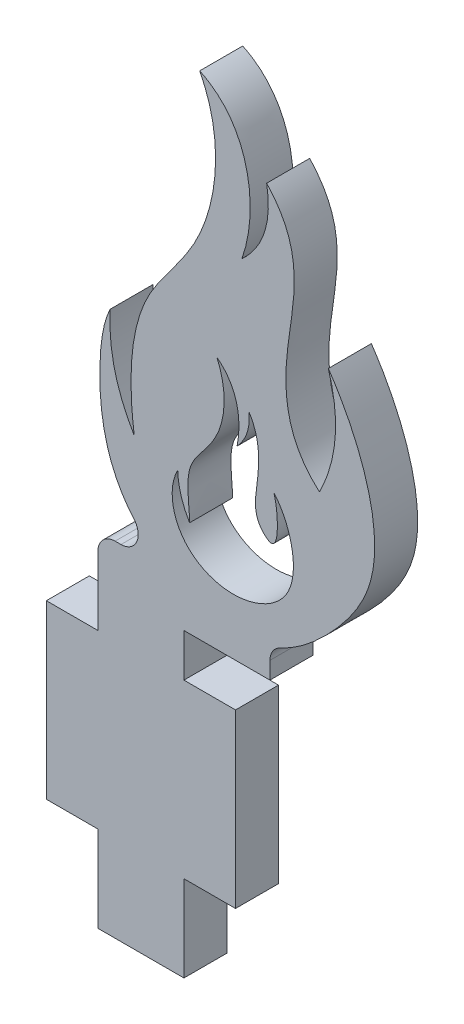
ISO-10303-21;
HEADER;
FILE_DESCRIPTION(('STEP AP214'),'2;1');
FILE_NAME('part.step','',(''),(''),'','','');
FILE_SCHEMA(('AUTOMOTIVE_DESIGN { 1 0 10303 214 1 1 1 1 }'));
ENDSEC;
DATA;
#1=APPLICATION_CONTEXT('core data for automotive mechanical design processes');
#2=APPLICATION_PROTOCOL_DEFINITION('international standard','automotive_design',2000,#1);
#3=PRODUCT_CONTEXT('',#1,'mechanical');
#4=PRODUCT('Part','Part','',(#3));
#5=PRODUCT_RELATED_PRODUCT_CATEGORY('part','',(#4));
#6=PRODUCT_DEFINITION_FORMATION('','',#4);
#7=PRODUCT_DEFINITION_CONTEXT('part definition',#1,'design');
#8=PRODUCT_DEFINITION('design','',#6,#7);
#9=PRODUCT_DEFINITION_SHAPE('','',#8);
#10=(LENGTH_UNIT() NAMED_UNIT(*) SI_UNIT(.MILLI.,.METRE.));
#11=(NAMED_UNIT(*) PLANE_ANGLE_UNIT() SI_UNIT($,.RADIAN.));
#12=(NAMED_UNIT(*) SI_UNIT($,.STERADIAN.) SOLID_ANGLE_UNIT());
#13=UNCERTAINTY_MEASURE_WITH_UNIT(LENGTH_MEASURE(1.E-05),#10,'distance_accuracy_value','');
#14=(GEOMETRIC_REPRESENTATION_CONTEXT(3) GLOBAL_UNCERTAINTY_ASSIGNED_CONTEXT((#13)) GLOBAL_UNIT_ASSIGNED_CONTEXT((#10,
#11,#12)) REPRESENTATION_CONTEXT('',''));
#15=CARTESIAN_POINT('',(0.,0.,0.));
#16=DIRECTION('',(0.,0.,1.));
#17=DIRECTION('',(1.,0.,0.));
#18=AXIS2_PLACEMENT_3D('',#15,#16,#17);
#19=CARTESIAN_POINT('',(0.,10.,2.5));
#20=DIRECTION('',(0.,1.,0.));
#21=DIRECTION('',(0.,0.,1.));
#22=AXIS2_PLACEMENT_3D('',#19,#20,#21);
#23=PLANE('',#22);
#24=DIRECTION('',(1.,0.,0.));
#25=VECTOR('',#24,1.);
#26=CARTESIAN_POINT('',(0.,10.,0.));
#27=LINE('',#26,#25);
#28=CARTESIAN_POINT('',(-1.5,10.,0.));
#29=VERTEX_POINT('',#28);
#30=CARTESIAN_POINT('',(-1.15846621936042,10.,0.));
#31=VERTEX_POINT('',#30);
#32=EDGE_CURVE('E456',#29,#31,#27,.T.);
#33=ORIENTED_EDGE('',*,*,#32,.F.);
#34=DIRECTION('',(0.,0.,-1.));
#35=VECTOR('',#34,1.);
#36=CARTESIAN_POINT('',(-1.5,10.,2.5));
#37=LINE('',#36,#35);
#38=CARTESIAN_POINT('',(-1.5,10.,2.5));
#39=VERTEX_POINT('',#38);
#40=EDGE_CURVE('E493',#29,#39,#37,.F.);
#41=ORIENTED_EDGE('',*,*,#40,.T.);
#42=DIRECTION('',(1.,0.,0.));
#43=VECTOR('',#42,1.);
#44=CARTESIAN_POINT('',(0.,10.,2.5));
#45=LINE('',#44,#43);
#46=CARTESIAN_POINT('',(-1.15846621936042,10.,2.5));
#47=VERTEX_POINT('',#46);
#48=EDGE_CURVE('E426',#39,#47,#45,.T.);
#49=ORIENTED_EDGE('',*,*,#48,.T.);
#50=DIRECTION('',(0.,0.,-1.));
#51=VECTOR('',#50,1.);
#52=CARTESIAN_POINT('',(-1.15846621936042,10.,2.5));
#53=LINE('',#52,#51);
#54=EDGE_CURVE('E490',#47,#31,#53,.T.);
#55=ORIENTED_EDGE('',*,*,#54,.T.);
#56=EDGE_LOOP('',(#33,#41,#49,#55));
#57=FACE_BOUND('',#56,.T.);
#58=ADVANCED_FACE('F36',(#57),#23,.T.);
#59=CARTESIAN_POINT('',(7.5,10.,-5.59016994374948));
#60=DIRECTION('',(1.,0.,0.));
#61=DIRECTION('',(0.,1.,0.));
#62=AXIS2_PLACEMENT_3D('',#59,#60,#61);
#63=PLANE('',#62);
#64=DIRECTION('',(0.,-1.,0.));
#65=VECTOR('',#64,1.);
#66=CARTESIAN_POINT('',(7.5,10.,0.));
#67=LINE('',#66,#65);
#68=CARTESIAN_POINT('',(7.5,8.49663509652156,0.));
#69=VERTEX_POINT('',#68);
#70=CARTESIAN_POINT('',(7.5,7.5,0.));
#71=VERTEX_POINT('',#70);
#72=EDGE_CURVE('E387',#69,#71,#67,.T.);
#73=ORIENTED_EDGE('',*,*,#72,.F.);
#74=DIRECTION('',(0.,0.,-1.));
#75=VECTOR('',#74,1.);
#76=CARTESIAN_POINT('',(7.5,8.49663509652156,-5.59016994374948));
#77=LINE('',#76,#75);
#78=CARTESIAN_POINT('',(7.5,8.49663509652156,2.5));
#79=VERTEX_POINT('',#78);
#80=EDGE_CURVE('E498',#69,#79,#77,.F.);
#81=ORIENTED_EDGE('',*,*,#80,.T.);
#82=DIRECTION('',(0.,1.,0.));
#83=VECTOR('',#82,1.);
#84=CARTESIAN_POINT('',(7.5,10.,2.5));
#85=LINE('',#84,#83);
#86=CARTESIAN_POINT('',(7.5,7.5,2.5));
#87=VERTEX_POINT('',#86);
#88=EDGE_CURVE('E393',#87,#79,#85,.T.);
#89=ORIENTED_EDGE('',*,*,#88,.F.);
#90=DIRECTION('',(0.,0.,1.));
#91=VECTOR('',#90,1.);
#92=CARTESIAN_POINT('',(7.5,7.5,-5.59016994374948));
#93=LINE('',#92,#91);
#94=EDGE_CURVE('E390',#71,#87,#93,.T.);
#95=ORIENTED_EDGE('',*,*,#94,.F.);
#96=EDGE_LOOP('',(#73,#81,#89,#95));
#97=FACE_BOUND('',#96,.T.);
#98=ADVANCED_FACE('F565',(#97),#63,.T.);
#99=CARTESIAN_POINT('',(-5.5,0.,2.5));
#100=DIRECTION('',(1.,0.,0.));
#101=DIRECTION('',(0.,1.,0.));
#102=AXIS2_PLACEMENT_3D('',#99,#100,#101);
#103=PLANE('',#102);
#104=DIRECTION('',(0.,-1.,0.));
#105=VECTOR('',#104,1.);
#106=CARTESIAN_POINT('',(-5.5,0.,0.));
#107=LINE('',#106,#105);
#108=CARTESIAN_POINT('',(-5.50000000000001,5.,0.));
#109=VERTEX_POINT('',#108);
#110=CARTESIAN_POINT('',(-5.5,-5.,0.));
#111=VERTEX_POINT('',#110);
#112=EDGE_CURVE('E401',#109,#111,#107,.T.);
#113=ORIENTED_EDGE('',*,*,#112,.T.);
#114=DIRECTION('',(0.,0.,-1.));
#115=VECTOR('',#114,1.);
#116=CARTESIAN_POINT('',(-5.5,-5.,2.5));
#117=LINE('',#116,#115);
#118=CARTESIAN_POINT('',(-5.5,-5.,2.5));
#119=VERTEX_POINT('',#118);
#120=EDGE_CURVE('E482',#119,#111,#117,.T.);
#121=ORIENTED_EDGE('',*,*,#120,.F.);
#122=DIRECTION('',(0.,-1.,0.));
#123=VECTOR('',#122,1.);
#124=CARTESIAN_POINT('',(-5.5,0.,2.5));
#125=LINE('',#124,#123);
#126=CARTESIAN_POINT('',(-5.50000000000001,5.,2.5));
#127=VERTEX_POINT('',#126);
#128=EDGE_CURVE('E402',#127,#119,#125,.T.);
#129=ORIENTED_EDGE('',*,*,#128,.F.);
#130=DIRECTION('',(0.,0.,-1.));
#131=VECTOR('',#130,1.);
#132=CARTESIAN_POINT('',(-5.50000000000001,5.,2.5));
#133=LINE('',#132,#131);
#134=EDGE_CURVE('E432',#127,#109,#133,.T.);
#135=ORIENTED_EDGE('',*,*,#134,.T.);
#136=EDGE_LOOP('',(#113,#121,#129,#135));
#137=FACE_BOUND('',#136,.T.);
#138=ADVANCED_FACE('F608',(#137),#103,.F.);
#139=CARTESIAN_POINT('',(0.,-5.,2.5));
#140=DIRECTION('',(0.,1.,0.));
#141=DIRECTION('',(-1.,0.,0.));
#142=AXIS2_PLACEMENT_3D('',#139,#140,#141);
#143=PLANE('',#142);
#144=DIRECTION('',(1.,0.,0.));
#145=VECTOR('',#144,1.);
#146=CARTESIAN_POINT('',(0.,-5.,0.));
#147=LINE('',#146,#145);
#148=CARTESIAN_POINT('',(-2.5,-5.,0.));
#149=VERTEX_POINT('',#148);
#150=EDGE_CURVE('E435',#111,#149,#147,.T.);
#151=ORIENTED_EDGE('',*,*,#150,.T.);
#152=DIRECTION('',(0.,0.,-1.));
#153=VECTOR('',#152,1.);
#154=CARTESIAN_POINT('',(-2.5,-5.,2.5));
#155=LINE('',#154,#153);
#156=CARTESIAN_POINT('',(-2.5,-5.,2.5));
#157=VERTEX_POINT('',#156);
#158=EDGE_CURVE('E479',#157,#149,#155,.T.);
#159=ORIENTED_EDGE('',*,*,#158,.F.);
#160=DIRECTION('',(1.,0.,0.));
#161=VECTOR('',#160,1.);
#162=CARTESIAN_POINT('',(0.,-5.,2.5));
#163=LINE('',#162,#161);
#164=EDGE_CURVE('E405',#119,#157,#163,.T.);
#165=ORIENTED_EDGE('',*,*,#164,.F.);
#166=ORIENTED_EDGE('',*,*,#120,.T.);
#167=EDGE_LOOP('',(#151,#159,#165,#166));
#168=FACE_BOUND('',#167,.T.);
#169=ADVANCED_FACE('F605',(#168),#143,.F.);
#170=CARTESIAN_POINT('',(-2.5,0.,2.5));
#171=DIRECTION('',(1.,0.,0.));
#172=DIRECTION('',(0.,1.,0.));
#173=AXIS2_PLACEMENT_3D('',#170,#171,#172);
#174=PLANE('',#173);
#175=DIRECTION('',(0.,-1.,0.));
#176=VECTOR('',#175,1.);
#177=CARTESIAN_POINT('',(-2.5,0.,0.));
#178=LINE('',#177,#176);
#179=CARTESIAN_POINT('',(-2.5,-10.,0.));
#180=VERTEX_POINT('',#179);
#181=EDGE_CURVE('E437',#149,#180,#178,.T.);
#182=ORIENTED_EDGE('',*,*,#181,.T.);
#183=DIRECTION('',(0.,0.,-1.));
#184=VECTOR('',#183,1.);
#185=CARTESIAN_POINT('',(-2.5,-10.,2.5));
#186=LINE('',#185,#184);
#187=CARTESIAN_POINT('',(-2.5,-10.,2.5));
#188=VERTEX_POINT('',#187);
#189=EDGE_CURVE('E476',#188,#180,#186,.T.);
#190=ORIENTED_EDGE('',*,*,#189,.F.);
#191=DIRECTION('',(0.,-1.,0.));
#192=VECTOR('',#191,1.);
#193=CARTESIAN_POINT('',(-2.5,0.,2.5));
#194=LINE('',#193,#192);
#195=EDGE_CURVE('E408',#157,#188,#194,.T.);
#196=ORIENTED_EDGE('',*,*,#195,.F.);
#197=ORIENTED_EDGE('',*,*,#158,.T.);
#198=EDGE_LOOP('',(#182,#190,#196,#197));
#199=FACE_BOUND('',#198,.T.);
#200=ADVANCED_FACE('F599',(#199),#174,.F.);
#201=CARTESIAN_POINT('',(0.,-10.,2.5));
#202=DIRECTION('',(0.,1.,0.));
#203=DIRECTION('',(0.,0.,1.));
#204=AXIS2_PLACEMENT_3D('',#201,#202,#203);
#205=PLANE('',#204);
#206=DIRECTION('',(1.,0.,0.));
#207=VECTOR('',#206,1.);
#208=CARTESIAN_POINT('',(0.,-10.,0.));
#209=LINE('',#208,#207);
#210=CARTESIAN_POINT('',(2.5,-10.,0.));
#211=VERTEX_POINT('',#210);
#212=EDGE_CURVE('E439',#180,#211,#209,.T.);
#213=ORIENTED_EDGE('',*,*,#212,.T.);
#214=DIRECTION('',(0.,0.,-1.));
#215=VECTOR('',#214,1.);
#216=CARTESIAN_POINT('',(2.5,-10.,2.5));
#217=LINE('',#216,#215);
#218=CARTESIAN_POINT('',(2.5,-10.,2.5));
#219=VERTEX_POINT('',#218);
#220=EDGE_CURVE('E474',#219,#211,#217,.T.);
#221=ORIENTED_EDGE('',*,*,#220,.F.);
#222=DIRECTION('',(1.,0.,0.));
#223=VECTOR('',#222,1.);
#224=CARTESIAN_POINT('',(0.,-10.,2.5));
#225=LINE('',#224,#223);
#226=EDGE_CURVE('E410',#188,#219,#225,.T.);
#227=ORIENTED_EDGE('',*,*,#226,.F.);
#228=ORIENTED_EDGE('',*,*,#189,.T.);
#229=EDGE_LOOP('',(#213,#221,#227,#228));
#230=FACE_BOUND('',#229,.T.);
#231=ADVANCED_FACE('F595',(#230),#205,.F.);
#232=CARTESIAN_POINT('',(2.5,0.,2.5));
#233=DIRECTION('',(1.,0.,0.));
#234=DIRECTION('',(0.,1.,0.));
#235=AXIS2_PLACEMENT_3D('',#232,#233,#234);
#236=PLANE('',#235);
#237=DIRECTION('',(0.,-1.,0.));
#238=VECTOR('',#237,1.);
#239=CARTESIAN_POINT('',(2.5,0.,0.));
#240=LINE('',#239,#238);
#241=CARTESIAN_POINT('',(2.5,-5.,0.));
#242=VERTEX_POINT('',#241);
#243=EDGE_CURVE('E443',#242,#211,#240,.T.);
#244=ORIENTED_EDGE('',*,*,#243,.F.);
#245=DIRECTION('',(0.,0.,-1.));
#246=VECTOR('',#245,1.);
#247=CARTESIAN_POINT('',(2.5,-5.,2.5));
#248=LINE('',#247,#246);
#249=CARTESIAN_POINT('',(2.5,-5.,2.5));
#250=VERTEX_POINT('',#249);
#251=EDGE_CURVE('E472',#250,#242,#248,.T.);
#252=ORIENTED_EDGE('',*,*,#251,.F.);
#253=DIRECTION('',(0.,-1.,0.));
#254=VECTOR('',#253,1.);
#255=CARTESIAN_POINT('',(2.5,0.,2.5));
#256=LINE('',#255,#254);
#257=EDGE_CURVE('E413',#250,#219,#256,.T.);
#258=ORIENTED_EDGE('',*,*,#257,.T.);
#259=ORIENTED_EDGE('',*,*,#220,.T.);
#260=EDGE_LOOP('',(#244,#252,#258,#259));
#261=FACE_BOUND('',#260,.T.);
#262=ADVANCED_FACE('F590',(#261),#236,.T.);
#263=CARTESIAN_POINT('',(0.,-5.,2.5));
#264=DIRECTION('',(0.,-1.,0.));
#265=DIRECTION('',(1.,0.,0.));
#266=AXIS2_PLACEMENT_3D('',#263,#264,#265);
#267=PLANE('',#266);
#268=DIRECTION('',(-1.,0.,0.));
#269=VECTOR('',#268,1.);
#270=CARTESIAN_POINT('',(0.,-5.,0.));
#271=LINE('',#270,#269);
#272=CARTESIAN_POINT('',(5.5,-5.,0.));
#273=VERTEX_POINT('',#272);
#274=EDGE_CURVE('E446',#273,#242,#271,.T.);
#275=ORIENTED_EDGE('',*,*,#274,.F.);
#276=DIRECTION('',(0.,0.,-1.));
#277=VECTOR('',#276,1.);
#278=CARTESIAN_POINT('',(5.5,-5.,2.5));
#279=LINE('',#278,#277);
#280=CARTESIAN_POINT('',(5.5,-5.,2.5));
#281=VERTEX_POINT('',#280);
#282=EDGE_CURVE('E470',#281,#273,#279,.T.);
#283=ORIENTED_EDGE('',*,*,#282,.F.);
#284=DIRECTION('',(-1.,0.,0.));
#285=VECTOR('',#284,1.);
#286=CARTESIAN_POINT('',(0.,-5.,2.5));
#287=LINE('',#286,#285);
#288=EDGE_CURVE('E416',#281,#250,#287,.T.);
#289=ORIENTED_EDGE('',*,*,#288,.T.);
#290=ORIENTED_EDGE('',*,*,#251,.T.);
#291=EDGE_LOOP('',(#275,#283,#289,#290));
#292=FACE_BOUND('',#291,.T.);
#293=ADVANCED_FACE('F585',(#292),#267,.T.);
#294=CARTESIAN_POINT('',(5.50000000000001,0.,2.5));
#295=DIRECTION('',(1.,0.,0.));
#296=DIRECTION('',(0.,1.,0.));
#297=AXIS2_PLACEMENT_3D('',#294,#295,#296);
#298=PLANE('',#297);
#299=DIRECTION('',(0.,-1.,0.));
#300=VECTOR('',#299,1.);
#301=CARTESIAN_POINT('',(5.50000000000001,0.,0.));
#302=LINE('',#301,#300);
#303=CARTESIAN_POINT('',(5.50000000000001,5.,0.));
#304=VERTEX_POINT('',#303);
#305=EDGE_CURVE('E450',#304,#273,#302,.T.);
#306=ORIENTED_EDGE('',*,*,#305,.F.);
#307=DIRECTION('',(0.,0.,-1.));
#308=VECTOR('',#307,1.);
#309=CARTESIAN_POINT('',(5.50000000000001,5.,2.5));
#310=LINE('',#309,#308);
#311=CARTESIAN_POINT('',(5.50000000000001,5.,2.5));
#312=VERTEX_POINT('',#311);
#313=EDGE_CURVE('E468',#312,#304,#310,.T.);
#314=ORIENTED_EDGE('',*,*,#313,.F.);
#315=DIRECTION('',(0.,-1.,0.));
#316=VECTOR('',#315,1.);
#317=CARTESIAN_POINT('',(5.50000000000001,0.,2.5));
#318=LINE('',#317,#316);
#319=EDGE_CURVE('E420',#312,#281,#318,.T.);
#320=ORIENTED_EDGE('',*,*,#319,.T.);
#321=ORIENTED_EDGE('',*,*,#282,.T.);
#322=EDGE_LOOP('',(#306,#314,#320,#321));
#323=FACE_BOUND('',#322,.T.);
#324=ADVANCED_FACE('F579',(#323),#298,.T.);
#325=CARTESIAN_POINT('',(0.,5.,2.5));
#326=DIRECTION('',(0.,-1.,0.));
#327=DIRECTION('',(1.,0.,0.));
#328=AXIS2_PLACEMENT_3D('',#325,#326,#327);
#329=PLANE('',#328);
#330=DIRECTION('',(-1.,0.,0.));
#331=VECTOR('',#330,1.);
#332=CARTESIAN_POINT('',(0.,5.,0.));
#333=LINE('',#332,#331);
#334=CARTESIAN_POINT('',(2.5,5.,0.));
#335=VERTEX_POINT('',#334);
#336=EDGE_CURVE('E453',#304,#335,#333,.T.);
#337=ORIENTED_EDGE('',*,*,#336,.T.);
#338=DIRECTION('',(0.,0.,-1.));
#339=VECTOR('',#338,1.);
#340=CARTESIAN_POINT('',(2.5,5.,2.5));
#341=LINE('',#340,#339);
#342=CARTESIAN_POINT('',(2.5,5.,2.5));
#343=VERTEX_POINT('',#342);
#344=EDGE_CURVE('E465',#343,#335,#341,.T.);
#345=ORIENTED_EDGE('',*,*,#344,.F.);
#346=DIRECTION('',(-1.,0.,0.));
#347=VECTOR('',#346,1.);
#348=CARTESIAN_POINT('',(0.,5.,2.5));
#349=LINE('',#348,#347);
#350=EDGE_CURVE('E423',#312,#343,#349,.T.);
#351=ORIENTED_EDGE('',*,*,#350,.F.);
#352=ORIENTED_EDGE('',*,*,#313,.T.);
#353=EDGE_LOOP('',(#337,#345,#351,#352));
#354=FACE_BOUND('',#353,.T.);
#355=ADVANCED_FACE('F619',(#354),#329,.F.);
#356=DIRECTION('',(0.,0.,1.));
#357=VECTOR('',#356,1.);
#358=CARTESIAN_POINT('',(2.5,7.5,-5.59016994374948));
#359=LINE('',#358,#357);
#360=CARTESIAN_POINT('',(2.5,7.5,0.));
#361=VERTEX_POINT('',#360);
#362=CARTESIAN_POINT('',(2.5,7.5,2.5));
#363=VERTEX_POINT('',#362);
#364=EDGE_CURVE('E395',#361,#363,#359,.T.);
#365=ORIENTED_EDGE('',*,*,#364,.T.);
#366=EDGE_CURVE('E417',#363,#343,#256,.T.);
#367=ORIENTED_EDGE('',*,*,#366,.T.);
#368=ORIENTED_EDGE('',*,*,#344,.T.);
#369=EDGE_CURVE('E447',#361,#335,#240,.T.);
#370=ORIENTED_EDGE('',*,*,#369,.F.);
#371=EDGE_LOOP('',(#365,#367,#368,#370));
#372=FACE_BOUND('',#371,.T.);
#373=ADVANCED_FACE('F573',(#372),#236,.T.);
#374=CARTESIAN_POINT('',(-2.5,9.,2.5));
#375=VERTEX_POINT('',#374);
#376=CARTESIAN_POINT('',(-2.5,5.,2.5));
#377=VERTEX_POINT('',#376);
#378=EDGE_CURVE('E411',#375,#377,#194,.T.);
#379=ORIENTED_EDGE('',*,*,#378,.F.);
#380=DIRECTION('',(0.,0.,-1.));
#381=VECTOR('',#380,1.);
#382=CARTESIAN_POINT('',(-2.5,9.,0.));
#383=LINE('',#382,#381);
#384=CARTESIAN_POINT('',(-2.5,9.,0.));
#385=VERTEX_POINT('',#384);
#386=EDGE_CURVE('E485',#375,#385,#383,.T.);
#387=ORIENTED_EDGE('',*,*,#386,.T.);
#388=CARTESIAN_POINT('',(-2.5,5.,0.));
#389=VERTEX_POINT('',#388);
#390=EDGE_CURVE('E440',#385,#389,#178,.T.);
#391=ORIENTED_EDGE('',*,*,#390,.T.);
#392=DIRECTION('',(0.,0.,-1.));
#393=VECTOR('',#392,1.);
#394=CARTESIAN_POINT('',(-2.5,5.,2.5));
#395=LINE('',#394,#393);
#396=EDGE_CURVE('E462',#377,#389,#395,.T.);
#397=ORIENTED_EDGE('',*,*,#396,.F.);
#398=EDGE_LOOP('',(#379,#387,#391,#397));
#399=FACE_BOUND('',#398,.T.);
#400=ADVANCED_FACE('F615',(#399),#174,.F.);
#401=CARTESIAN_POINT('',(0.,5.,2.5));
#402=DIRECTION('',(0.,1.,0.));
#403=DIRECTION('',(-1.,0.,0.));
#404=AXIS2_PLACEMENT_3D('',#401,#402,#403);
#405=PLANE('',#404);
#406=DIRECTION('',(1.,0.,0.));
#407=VECTOR('',#406,1.);
#408=CARTESIAN_POINT('',(0.,5.,0.));
#409=LINE('',#408,#407);
#410=EDGE_CURVE('E406',#109,#389,#409,.T.);
#411=ORIENTED_EDGE('',*,*,#410,.F.);
#412=ORIENTED_EDGE('',*,*,#134,.F.);
#413=DIRECTION('',(1.,0.,0.));
#414=VECTOR('',#413,1.);
#415=CARTESIAN_POINT('',(0.,5.,2.5));
#416=LINE('',#415,#414);
#417=EDGE_CURVE('E429',#127,#377,#416,.T.);
#418=ORIENTED_EDGE('',*,*,#417,.T.);
#419=ORIENTED_EDGE('',*,*,#396,.T.);
#420=EDGE_LOOP('',(#411,#412,#418,#419));
#421=FACE_BOUND('',#420,.T.);
#422=ADVANCED_FACE('F611',(#421),#405,.T.);
#423=CARTESIAN_POINT('',(0.,0.,2.5));
#424=DIRECTION('',(0.,0.,1.));
#425=DIRECTION('',(1.,0.,0.));
#426=AXIS2_PLACEMENT_3D('',#423,#424,#425);
#427=PLANE('',#426);
#428=ORIENTED_EDGE('',*,*,#48,.F.);
#429=CARTESIAN_POINT('',(-1.5,9.,2.5));
#430=DIRECTION('',(0.,0.,1.));
#431=DIRECTION('',(1.,0.,0.));
#432=AXIS2_PLACEMENT_3D('',#429,#430,#431);
#433=CIRCLE('',#432,1.);
#434=EDGE_CURVE('E495',#39,#375,#433,.T.);
#435=ORIENTED_EDGE('',*,*,#434,.T.);
#436=ORIENTED_EDGE('',*,*,#378,.T.);
#437=ORIENTED_EDGE('',*,*,#417,.F.);
#438=ORIENTED_EDGE('',*,*,#128,.T.);
#439=ORIENTED_EDGE('',*,*,#164,.T.);
#440=ORIENTED_EDGE('',*,*,#195,.T.);
#441=ORIENTED_EDGE('',*,*,#226,.T.);
#442=ORIENTED_EDGE('',*,*,#257,.F.);
#443=ORIENTED_EDGE('',*,*,#288,.F.);
#444=ORIENTED_EDGE('',*,*,#319,.F.);
#445=ORIENTED_EDGE('',*,*,#350,.T.);
#446=ORIENTED_EDGE('',*,*,#366,.F.);
#447=DIRECTION('',(1.,0.,0.));
#448=VECTOR('',#447,1.);
#449=CARTESIAN_POINT('',(2.5,7.5,2.5));
#450=LINE('',#449,#448);
#451=EDGE_CURVE('E386',#363,#87,#450,.T.);
#452=ORIENTED_EDGE('',*,*,#451,.T.);
#453=ORIENTED_EDGE('',*,*,#88,.T.);
#454=CARTESIAN_POINT('',(8.5,8.49663509652156,2.5));
#455=DIRECTION('',(0.,0.,1.));
#456=DIRECTION('',(1.,0.,0.));
#457=AXIS2_PLACEMENT_3D('',#454,#455,#456);
#458=CIRCLE('',#457,1.);
#459=CARTESIAN_POINT('',(8.07610326469869,9.40234562301493,2.5));
#460=VERTEX_POINT('',#459);
#461=EDGE_CURVE('E44',#79,#460,#458,.F.);
#462=ORIENTED_EDGE('',*,*,#461,.T.);
#463=CARTESIAN_POINT('',(2.90916647302122,9.46291685168149,2.5));
#464=CARTESIAN_POINT('',(6.39943051731389,7.87311154991793,2.5));
#465=CARTESIAN_POINT('',(10.2382020265354,10.2578230693302,2.5));
#466=CARTESIAN_POINT('',(14.9468825397884,16.7870091360304,2.5));
#467=CARTESIAN_POINT('',(12.6497271302654,22.3534698319257,2.5));
#468=CARTESIAN_POINT('',(10.8967882294419,24.8934960124732,2.5));
#469=B_SPLINE_CURVE_WITH_KNOTS('',3,(#463,#464,#465,#466,#467,#468),.UNSPECIFIED.,.F.,.F.,(4,1,
1,4),(0.,0.389024701927192,0.557377695069422,1.),.UNSPECIFIED.);
#470=CARTESIAN_POINT('',(10.8967882294419,24.8934960124732,2.5));
#471=VERTEX_POINT('',#470);
#472=EDGE_CURVE('E362',#460,#471,#469,.T.);
#473=ORIENTED_EDGE('',*,*,#472,.T.);
#474=CARTESIAN_POINT('',(10.8967882294419,24.8934960124732,2.5));
#475=CARTESIAN_POINT('',(11.9462263480378,21.5261997151264,2.5));
#476=CARTESIAN_POINT('',(10.3807569453845,18.4159454204896,2.5));
#477=B_SPLINE_CURVE_WITH_KNOTS('',2,(#474,#475,#476),.UNSPECIFIED.,.F.,.F.,(3,3),(0.,1.),.UNSPECIFIED.);
#478=CARTESIAN_POINT('',(10.3807569453845,18.4159454204896,2.5));
#479=VERTEX_POINT('',#478);
#480=EDGE_CURVE('E554',#471,#479,#477,.T.);
#481=ORIENTED_EDGE('',*,*,#480,.T.);
#482=CARTESIAN_POINT('',(10.3807569453845,18.4159454204896,2.5));
#483=CARTESIAN_POINT('',(8.5696714963339,19.9896001001792,2.5));
#484=CARTESIAN_POINT('',(7.92528729291444,24.9795493017592,2.5));
#485=CARTESIAN_POINT('',(9.79946913799527,29.7916825985778,2.5));
#486=CARTESIAN_POINT('',(7.30963851439545,32.4277745593494,2.5));
#487=B_SPLINE_CURVE_WITH_KNOTS('',3,(#482,#483,#484,#485,#486),.UNSPECIFIED.,.F.,.F.,(4,1,4),
(0.,0.418496680943528,1.),.UNSPECIFIED.);
#488=CARTESIAN_POINT('',(7.30963851439545,32.4277745593494,2.5));
#489=VERTEX_POINT('',#488);
#490=EDGE_CURVE('E550',#479,#489,#487,.T.);
#491=ORIENTED_EDGE('',*,*,#490,.T.);
#492=CARTESIAN_POINT('',(7.30963851439545,32.4277745593494,2.5));
#493=CARTESIAN_POINT('',(7.79579394391774,29.6846492613264,2.5));
#494=CARTESIAN_POINT('',(5.86741891701107,27.9008074897817,2.5));
#495=B_SPLINE_CURVE_WITH_KNOTS('',2,(#492,#493,#494),.UNSPECIFIED.,.F.,.F.,(3,3),(0.,1.),.UNSPECIFIED.);
#496=CARTESIAN_POINT('',(5.86741891701107,27.9008074897817,2.5));
#497=VERTEX_POINT('',#496);
#498=EDGE_CURVE('E541',#489,#497,#495,.T.);
#499=ORIENTED_EDGE('',*,*,#498,.T.);
#500=CARTESIAN_POINT('',(5.86741891701107,27.9008074897817,2.5));
#501=CARTESIAN_POINT('',(6.87586969719308,30.6837173458811,2.5));
#502=CARTESIAN_POINT('',(6.42536950874217,34.7317857062198,2.5));
#503=CARTESIAN_POINT('',(3.41730986596149,36.1404449810456,2.5));
#504=B_SPLINE_CURVE_WITH_KNOTS('',3,(#500,#501,#502,#503),.UNSPECIFIED.,.F.,.F.,(4,4),(0.,1.),.UNSPECIFIED.);
#505=CARTESIAN_POINT('',(3.41730986596149,36.1404449810456,2.5));
#506=VERTEX_POINT('',#505);
#507=EDGE_CURVE('E536',#497,#506,#504,.T.);
#508=ORIENTED_EDGE('',*,*,#507,.T.);
#509=CARTESIAN_POINT('',(3.41730986596149,36.1404449810456,2.5));
#510=CARTESIAN_POINT('',(4.87732462625622,33.3574599283124,2.5));
#511=CARTESIAN_POINT('',(4.36643834335246,27.9311271779328,2.5));
#512=CARTESIAN_POINT('',(-0.730459831738037,22.7063000438649,2.5));
#513=CARTESIAN_POINT('',(-0.71071168214572,18.2317583115816,2.5));
#514=CARTESIAN_POINT('',(-0.386815041048261,15.8640498297613,2.5));
#515=B_SPLINE_CURVE_WITH_KNOTS('',3,(#509,#510,#511,#512,#513,#514),.UNSPECIFIED.,.F.,.F.,(4,1,
1,4),(0.,0.44006919886123,0.652999517611562,1.),.UNSPECIFIED.);
#516=CARTESIAN_POINT('',(-0.386815041048261,15.8640498297613,2.5));
#517=VERTEX_POINT('',#516);
#518=EDGE_CURVE('E532',#506,#517,#515,.T.);
#519=ORIENTED_EDGE('',*,*,#518,.T.);
#520=CARTESIAN_POINT('',(-0.386815041048261,15.8640498297613,2.5));
#521=CARTESIAN_POINT('',(-1.96020123197052,18.4900506471571,2.5));
#522=CARTESIAN_POINT('',(-1.79115991167627,21.5313224340129,2.5));
#523=B_SPLINE_CURVE_WITH_KNOTS('',2,(#520,#521,#522),.UNSPECIFIED.,.F.,.F.,(3,3),(0.,1.),.UNSPECIFIED.);
#524=CARTESIAN_POINT('',(-1.79115991167627,21.5313224340129,2.5));
#525=VERTEX_POINT('',#524);
#526=EDGE_CURVE('E302',#517,#525,#523,.T.);
#527=ORIENTED_EDGE('',*,*,#526,.T.);
#528=CARTESIAN_POINT('',(-1.79115991167627,21.5313224340129,2.5));
#529=CARTESIAN_POINT('',(-2.38272955380291,20.3403592133658,2.5));
#530=CARTESIAN_POINT('',(-2.41509527497277,11.4139397449798,2.5));
#531=CARTESIAN_POINT('',(2.90916647302122,9.46291685168149,2.5));
#532=B_SPLINE_CURVE_WITH_KNOTS('',2,(#528,#529,#530,#531),.UNSPECIFIED.,.F.,.F.,(3,1,3),(0.,
0.264437108148104,1.),.UNSPECIFIED.);
#533=CARTESIAN_POINT('',(-0.405174587390817,11.6576866405854,2.5));
#534=VERTEX_POINT('',#533);
#535=EDGE_CURVE('E296',#525,#534,#532,.T.);
#536=ORIENTED_EDGE('',*,*,#535,.T.);
#537=CARTESIAN_POINT('',(-1.15846621936042,11.,2.5));
#538=DIRECTION('',(0.,0.,1.));
#539=DIRECTION('',(1.,0.,0.));
#540=AXIS2_PLACEMENT_3D('',#537,#538,#539);
#541=CIRCLE('',#540,1.);
#542=EDGE_CURVE('E505',#534,#47,#541,.F.);
#543=ORIENTED_EDGE('',*,*,#542,.T.);
#544=EDGE_LOOP('',(#428,#435,#436,#437,#438,#439,#440,#441,#442,#443,#444,#445,#446,#452,#453,
#462,#473,#481,#491,#499,#508,#519,#527,#536,#543));
#545=FACE_BOUND('',#544,.T.);
#546=CARTESIAN_POINT('',(2.13829356102087,15.3894131835954,2.5));
#547=CARTESIAN_POINT('',(1.5652163953042,14.3028490668224,2.5));
#548=CARTESIAN_POINT('',(1.98957049838985,11.7036472435037,2.5));
#549=CARTESIAN_POINT('',(5.52247153528137,10.2410800776961,2.5));
#550=CARTESIAN_POINT('',(9.73079133365973,12.237177783962,2.5));
#551=CARTESIAN_POINT('',(8.68425822002371,15.9919300544522,2.5));
#552=CARTESIAN_POINT('',(7.71397604986662,17.077463845356,2.5));
#553=B_SPLINE_CURVE_WITH_KNOTS('',3,(#546,#547,#548,#549,#550,#551,#552),.UNSPECIFIED.,.F.,.F.,
(4,1,1,1,4),(0.,0.234608912144999,0.444601303592136,0.670183477363089,1.),.UNSPECIFIED.);
#554=CARTESIAN_POINT('',(2.13829356102087,15.3894131835954,2.5));
#555=VERTEX_POINT('',#554);
#556=CARTESIAN_POINT('',(7.71397604986662,17.077463845356,2.5));
#557=VERTEX_POINT('',#556);
#558=EDGE_CURVE('E250',#555,#557,#553,.T.);
#559=ORIENTED_EDGE('',*,*,#558,.F.);
#560=CARTESIAN_POINT('',(2.82885974083204,13.0875259175581,2.5));
#561=CARTESIAN_POINT('',(2.18140185417055,14.1568258747975,2.5));
#562=CARTESIAN_POINT('',(2.13829356102087,15.3894131835954,2.5));
#563=B_SPLINE_CURVE_WITH_KNOTS('',2,(#560,#561,#562),.UNSPECIFIED.,.F.,.F.,(3,3),(0.,1.),.UNSPECIFIED.);
#564=CARTESIAN_POINT('',(2.82885974083204,13.0875259175581,2.5));
#565=VERTEX_POINT('',#564);
#566=EDGE_CURVE('E240',#565,#555,#563,.T.);
#567=ORIENTED_EDGE('',*,*,#566,.F.);
#568=CARTESIAN_POINT('',(4.41460430187992,22.2183454061725,2.5));
#569=CARTESIAN_POINT('',(4.88908633941141,21.1788813553988,2.5));
#570=CARTESIAN_POINT('',(5.01415089890165,19.3896670912197,2.5));
#571=CARTESIAN_POINT('',(3.94768973355282,17.3861847757002,2.5));
#572=CARTESIAN_POINT('',(2.39389517855912,15.8364937534604,2.5));
#573=CARTESIAN_POINT('',(2.82822676349419,13.9974559170985,2.5));
#574=CARTESIAN_POINT('',(2.82885974083204,13.0875259175581,2.5));
#575=B_SPLINE_CURVE_WITH_KNOTS('',3,(#568,#569,#570,#571,#572,#573,#574),.UNSPECIFIED.,.F.,.F.,
(4,1,1,1,4),(0.,0.356670625447773,0.506163254702951,0.697958161774314,1.),.UNSPECIFIED.);
#576=CARTESIAN_POINT('',(4.41460430187992,22.2183454061725,2.5));
#577=VERTEX_POINT('',#576);
#578=EDGE_CURVE('E958',#577,#565,#575,.T.);
#579=ORIENTED_EDGE('',*,*,#578,.F.);
#580=CARTESIAN_POINT('',(5.59112446007672,18.3307135790874,2.5));
#581=CARTESIAN_POINT('',(5.87997863273723,19.7033150316755,2.5));
#582=CARTESIAN_POINT('',(5.64341897762865,21.2989415461941,2.5));
#583=CARTESIAN_POINT('',(4.41460430187992,22.2183454061725,2.5));
#584=B_SPLINE_CURVE_WITH_KNOTS('',3,(#580,#581,#582,#583),.UNSPECIFIED.,.F.,.F.,(4,4),(0.,1.),.UNSPECIFIED.);
#585=CARTESIAN_POINT('',(5.59112446007672,18.3307135790874,2.5));
#586=VERTEX_POINT('',#585);
#587=EDGE_CURVE('E963',#586,#577,#584,.T.);
#588=ORIENTED_EDGE('',*,*,#587,.F.);
#589=CARTESIAN_POINT('',(6.28169063988791,20.4024121185209,2.5));
#590=CARTESIAN_POINT('',(6.39830586446031,19.2002864860419,2.5));
#591=CARTESIAN_POINT('',(5.59112446007672,18.3307135790874,2.5));
#592=B_SPLINE_CURVE_WITH_KNOTS('',2,(#589,#590,#591),.UNSPECIFIED.,.F.,.F.,(3,3),(0.,1.),.UNSPECIFIED.);
#593=CARTESIAN_POINT('',(6.28169063988791,20.4024121185209,2.5));
#594=VERTEX_POINT('',#593);
#595=EDGE_CURVE('E266',#594,#586,#592,.T.);
#596=ORIENTED_EDGE('',*,*,#595,.F.);
#597=CARTESIAN_POINT('',(7.71397604986662,17.077463845356,2.5));
#598=CARTESIAN_POINT('',(7.91720600245546,16.6763451375132,2.5));
#599=CARTESIAN_POINT('',(8.22866448410831,13.7135349924248,2.5));
#600=CARTESIAN_POINT('',(6.48875000617115,15.2616801348113,2.5));
#601=CARTESIAN_POINT('',(6.85587282649337,17.4794615390146,2.5));
#602=CARTESIAN_POINT('',(6.96997609882853,19.3155754385208,2.5));
#603=CARTESIAN_POINT('',(6.28169063988791,20.4024121185209,2.5));
#604=B_SPLINE_CURVE_WITH_KNOTS('',3,(#597,#598,#599,#600,#601,#602,#603),.UNSPECIFIED.,.F.,.F.,
(4,1,1,1,4),(0.,0.298390971966361,0.375084695675647,0.606753795591812,1.),.UNSPECIFIED.);
#605=EDGE_CURVE('E264',#557,#594,#604,.T.);
#606=ORIENTED_EDGE('',*,*,#605,.F.);
#607=EDGE_LOOP('',(#559,#567,#579,#588,#596,#606));
#608=FACE_BOUND('',#607,.T.);
#609=ADVANCED_FACE('F262',(#545,#608),#427,.T.);
#610=CARTESIAN_POINT('',(0.,0.,0.));
#611=DIRECTION('',(0.,0.,1.));
#612=DIRECTION('',(1.,0.,0.));
#613=AXIS2_PLACEMENT_3D('',#610,#611,#612);
#614=PLANE('',#613);
#615=ORIENTED_EDGE('',*,*,#390,.F.);
#616=CARTESIAN_POINT('',(-1.5,9.,0.));
#617=DIRECTION('',(0.,0.,1.));
#618=DIRECTION('',(1.,0.,0.));
#619=AXIS2_PLACEMENT_3D('',#616,#617,#618);
#620=CIRCLE('',#619,1.);
#621=EDGE_CURVE('E488',#385,#29,#620,.F.);
#622=ORIENTED_EDGE('',*,*,#621,.T.);
#623=ORIENTED_EDGE('',*,*,#32,.T.);
#624=CARTESIAN_POINT('',(-1.15846621936042,11.,0.));
#625=DIRECTION('',(0.,0.,1.));
#626=DIRECTION('',(1.,0.,0.));
#627=AXIS2_PLACEMENT_3D('',#624,#625,#626);
#628=CIRCLE('',#627,1.);
#629=CARTESIAN_POINT('',(-0.405174587390817,11.6576866405854,0.));
#630=VERTEX_POINT('',#629);
#631=EDGE_CURVE('E503',#31,#630,#628,.T.);
#632=ORIENTED_EDGE('',*,*,#631,.T.);
#633=CARTESIAN_POINT('',(-1.79115991167627,21.5313224340129,0.));
#634=CARTESIAN_POINT('',(-2.38272955380291,20.3403592133658,0.));
#635=CARTESIAN_POINT('',(-2.41509527497277,11.4139397449798,0.));
#636=CARTESIAN_POINT('',(2.90916647302122,9.46291685168149,0.));
#637=B_SPLINE_CURVE_WITH_KNOTS('',2,(#633,#634,#635,#636),.UNSPECIFIED.,.F.,.F.,(3,1,3),(0.,
0.264437108148104,1.),.UNSPECIFIED.);
#638=CARTESIAN_POINT('',(-1.79115991167627,21.5313224340129,0.));
#639=VERTEX_POINT('',#638);
#640=EDGE_CURVE('E355',#639,#630,#637,.T.);
#641=ORIENTED_EDGE('',*,*,#640,.F.);
#642=CARTESIAN_POINT('',(-0.386815041048261,15.8640498297613,0.));
#643=CARTESIAN_POINT('',(-1.96020123197052,18.4900506471571,0.));
#644=CARTESIAN_POINT('',(-1.79115991167627,21.5313224340129,0.));
#645=B_SPLINE_CURVE_WITH_KNOTS('',2,(#642,#643,#644),.UNSPECIFIED.,.F.,.F.,(3,3),(0.,1.),.UNSPECIFIED.);
#646=CARTESIAN_POINT('',(-0.386815041048261,15.8640498297613,0.));
#647=VERTEX_POINT('',#646);
#648=EDGE_CURVE('E348',#647,#639,#645,.T.);
#649=ORIENTED_EDGE('',*,*,#648,.F.);
#650=CARTESIAN_POINT('',(3.41730986596149,36.1404449810456,0.));
#651=CARTESIAN_POINT('',(4.87732462625622,33.3574599283124,0.));
#652=CARTESIAN_POINT('',(4.36643834335246,27.9311271779328,0.));
#653=CARTESIAN_POINT('',(-0.730459831738037,22.7063000438649,0.));
#654=CARTESIAN_POINT('',(-0.71071168214572,18.2317583115816,0.));
#655=CARTESIAN_POINT('',(-0.386815041048261,15.8640498297613,0.));
#656=B_SPLINE_CURVE_WITH_KNOTS('',3,(#650,#651,#652,#653,#654,#655),.UNSPECIFIED.,.F.,.F.,(4,1,
1,4),(0.,0.44006919886123,0.652999517611562,1.),.UNSPECIFIED.);
#657=CARTESIAN_POINT('',(3.41730986596149,36.1404449810456,0.));
#658=VERTEX_POINT('',#657);
#659=EDGE_CURVE('E341',#658,#647,#656,.T.);
#660=ORIENTED_EDGE('',*,*,#659,.F.);
#661=CARTESIAN_POINT('',(5.86741891701107,27.9008074897817,0.));
#662=CARTESIAN_POINT('',(6.87586969719308,30.6837173458811,0.));
#663=CARTESIAN_POINT('',(6.42536950874217,34.7317857062198,0.));
#664=CARTESIAN_POINT('',(3.41730986596149,36.1404449810456,0.));
#665=B_SPLINE_CURVE_WITH_KNOTS('',3,(#661,#662,#663,#664),.UNSPECIFIED.,.F.,.F.,(4,4),(0.,1.),.UNSPECIFIED.);
#666=CARTESIAN_POINT('',(5.86741891701107,27.9008074897817,0.));
#667=VERTEX_POINT('',#666);
#668=EDGE_CURVE('E334',#667,#658,#665,.T.);
#669=ORIENTED_EDGE('',*,*,#668,.F.);
#670=CARTESIAN_POINT('',(7.30963851439545,32.4277745593494,0.));
#671=CARTESIAN_POINT('',(7.79579394391774,29.6846492613264,0.));
#672=CARTESIAN_POINT('',(5.86741891701107,27.9008074897817,0.));
#673=B_SPLINE_CURVE_WITH_KNOTS('',2,(#670,#671,#672),.UNSPECIFIED.,.F.,.F.,(3,3),(0.,1.),.UNSPECIFIED.);
#674=CARTESIAN_POINT('',(7.30963851439545,32.4277745593494,0.));
#675=VERTEX_POINT('',#674);
#676=EDGE_CURVE('E327',#675,#667,#673,.T.);
#677=ORIENTED_EDGE('',*,*,#676,.F.);
#678=CARTESIAN_POINT('',(10.3807569453845,18.4159454204896,0.));
#679=CARTESIAN_POINT('',(8.5696714963339,19.9896001001792,0.));
#680=CARTESIAN_POINT('',(7.92528729291444,24.9795493017592,0.));
#681=CARTESIAN_POINT('',(9.79946913799527,29.7916825985778,0.));
#682=CARTESIAN_POINT('',(7.30963851439545,32.4277745593494,0.));
#683=B_SPLINE_CURVE_WITH_KNOTS('',3,(#678,#679,#680,#681,#682),.UNSPECIFIED.,.F.,.F.,(4,1,4),
(0.,0.418496680943528,1.),.UNSPECIFIED.);
#684=CARTESIAN_POINT('',(10.3807569453845,18.4159454204896,0.));
#685=VERTEX_POINT('',#684);
#686=EDGE_CURVE('E320',#685,#675,#683,.T.);
#687=ORIENTED_EDGE('',*,*,#686,.F.);
#688=CARTESIAN_POINT('',(10.8967882294419,24.8934960124732,0.));
#689=CARTESIAN_POINT('',(11.9462263480378,21.5261997151264,0.));
#690=CARTESIAN_POINT('',(10.3807569453845,18.4159454204896,0.));
#691=B_SPLINE_CURVE_WITH_KNOTS('',2,(#688,#689,#690),.UNSPECIFIED.,.F.,.F.,(3,3),(0.,1.),.UNSPECIFIED.);
#692=CARTESIAN_POINT('',(10.8967882294419,24.8934960124732,0.));
#693=VERTEX_POINT('',#692);
#694=EDGE_CURVE('E313',#693,#685,#691,.T.);
#695=ORIENTED_EDGE('',*,*,#694,.F.);
#696=CARTESIAN_POINT('',(2.90916647302122,9.46291685168149,0.));
#697=CARTESIAN_POINT('',(6.39943051731389,7.87311154991793,0.));
#698=CARTESIAN_POINT('',(10.2382020265354,10.2578230693302,0.));
#699=CARTESIAN_POINT('',(14.9468825397884,16.7870091360304,0.));
#700=CARTESIAN_POINT('',(12.6497271302654,22.3534698319257,0.));
#701=CARTESIAN_POINT('',(10.8967882294419,24.8934960124732,0.));
#702=B_SPLINE_CURVE_WITH_KNOTS('',3,(#696,#697,#698,#699,#700,#701),.UNSPECIFIED.,.F.,.F.,(4,1,
1,4),(0.,0.389024701927192,0.557377695069422,1.),.UNSPECIFIED.);
#703=CARTESIAN_POINT('',(8.07610326469869,9.40234562301493,0.));
#704=VERTEX_POINT('',#703);
#705=EDGE_CURVE('E258',#704,#693,#702,.T.);
#706=ORIENTED_EDGE('',*,*,#705,.F.);
#707=CARTESIAN_POINT('',(8.5,8.49663509652156,0.));
#708=DIRECTION('',(0.,0.,1.));
#709=DIRECTION('',(1.,0.,0.));
#710=AXIS2_PLACEMENT_3D('',#707,#708,#709);
#711=CIRCLE('',#710,1.);
#712=EDGE_CURVE('E11',#704,#69,#711,.T.);
#713=ORIENTED_EDGE('',*,*,#712,.T.);
#714=ORIENTED_EDGE('',*,*,#72,.T.);
#715=DIRECTION('',(-1.,0.,0.));
#716=VECTOR('',#715,1.);
#717=CARTESIAN_POINT('',(2.5,7.5,0.));
#718=LINE('',#717,#716);
#719=EDGE_CURVE('E389',#71,#361,#718,.T.);
#720=ORIENTED_EDGE('',*,*,#719,.T.);
#721=ORIENTED_EDGE('',*,*,#369,.T.);
#722=ORIENTED_EDGE('',*,*,#336,.F.);
#723=ORIENTED_EDGE('',*,*,#305,.T.);
#724=ORIENTED_EDGE('',*,*,#274,.T.);
#725=ORIENTED_EDGE('',*,*,#243,.T.);
#726=ORIENTED_EDGE('',*,*,#212,.F.);
#727=ORIENTED_EDGE('',*,*,#181,.F.);
#728=ORIENTED_EDGE('',*,*,#150,.F.);
#729=ORIENTED_EDGE('',*,*,#112,.F.);
#730=ORIENTED_EDGE('',*,*,#410,.T.);
#731=EDGE_LOOP('',(#615,#622,#623,#632,#641,#649,#660,#669,#677,#687,#695,#706,#713,#714,#720,
#721,#722,#723,#724,#725,#726,#727,#728,#729,#730));
#732=FACE_BOUND('',#731,.T.);
#733=CARTESIAN_POINT('',(2.82885974083204,13.0875259175581,0.));
#734=CARTESIAN_POINT('',(2.18140185417055,14.1568258747975,0.));
#735=CARTESIAN_POINT('',(2.13829356102087,15.3894131835954,0.));
#736=B_SPLINE_CURVE_WITH_KNOTS('',2,(#733,#734,#735),.UNSPECIFIED.,.F.,.F.,(3,3),(0.,1.),.UNSPECIFIED.);
#737=CARTESIAN_POINT('',(2.82885974083204,13.0875259175581,0.));
#738=VERTEX_POINT('',#737);
#739=CARTESIAN_POINT('',(2.13829356102087,15.3894131835954,0.));
#740=VERTEX_POINT('',#739);
#741=EDGE_CURVE('E967',#738,#740,#736,.T.);
#742=ORIENTED_EDGE('',*,*,#741,.T.);
#743=CARTESIAN_POINT('',(2.13829356102087,15.3894131835954,0.));
#744=CARTESIAN_POINT('',(1.5652163953042,14.3028490668224,0.));
#745=CARTESIAN_POINT('',(1.98957049838985,11.7036472435037,0.));
#746=CARTESIAN_POINT('',(5.52247153528137,10.2410800776961,0.));
#747=CARTESIAN_POINT('',(9.73079133365973,12.237177783962,0.));
#748=CARTESIAN_POINT('',(8.68425822002371,15.9919300544522,0.));
#749=CARTESIAN_POINT('',(7.71397604986662,17.077463845356,0.));
#750=B_SPLINE_CURVE_WITH_KNOTS('',3,(#743,#744,#745,#746,#747,#748,#749),.UNSPECIFIED.,.F.,.F.,
(4,1,1,1,4),(0.,0.234608912144999,0.444601303592136,0.670183477363089,1.),.UNSPECIFIED.);
#751=CARTESIAN_POINT('',(7.71397604986662,17.077463845356,0.));
#752=VERTEX_POINT('',#751);
#753=EDGE_CURVE('E257',#740,#752,#750,.T.);
#754=ORIENTED_EDGE('',*,*,#753,.T.);
#755=CARTESIAN_POINT('',(7.71397604986662,17.077463845356,0.));
#756=CARTESIAN_POINT('',(7.91720600245546,16.6763451375132,0.));
#757=CARTESIAN_POINT('',(8.22866448410831,13.7135349924248,0.));
#758=CARTESIAN_POINT('',(6.48875000617115,15.2616801348113,0.));
#759=CARTESIAN_POINT('',(6.85587282649337,17.4794615390146,0.));
#760=CARTESIAN_POINT('',(6.96997609882853,19.3155754385208,0.));
#761=CARTESIAN_POINT('',(6.28169063988791,20.4024121185209,0.));
#762=B_SPLINE_CURVE_WITH_KNOTS('',3,(#755,#756,#757,#758,#759,#760,#761),.UNSPECIFIED.,.F.,.F.,
(4,1,1,1,4),(0.,0.298390971966361,0.375084695675647,0.606753795591812,1.),.UNSPECIFIED.);
#763=CARTESIAN_POINT('',(6.28169063988791,20.4024121185209,0.));
#764=VERTEX_POINT('',#763);
#765=EDGE_CURVE('E980',#752,#764,#762,.T.);
#766=ORIENTED_EDGE('',*,*,#765,.T.);
#767=CARTESIAN_POINT('',(6.28169063988791,20.4024121185209,0.));
#768=CARTESIAN_POINT('',(6.39830586446031,19.2002864860419,0.));
#769=CARTESIAN_POINT('',(5.59112446007672,18.3307135790874,0.));
#770=B_SPLINE_CURVE_WITH_KNOTS('',2,(#767,#768,#769),.UNSPECIFIED.,.F.,.F.,(3,3),(0.,1.),.UNSPECIFIED.);
#771=CARTESIAN_POINT('',(5.59112446007672,18.3307135790874,0.));
#772=VERTEX_POINT('',#771);
#773=EDGE_CURVE('E988',#764,#772,#770,.T.);
#774=ORIENTED_EDGE('',*,*,#773,.T.);
#775=CARTESIAN_POINT('',(5.59112446007672,18.3307135790874,0.));
#776=CARTESIAN_POINT('',(5.87997863273723,19.7033150316755,0.));
#777=CARTESIAN_POINT('',(5.64341897762865,21.2989415461941,0.));
#778=CARTESIAN_POINT('',(4.41460430187992,22.2183454061725,0.));
#779=B_SPLINE_CURVE_WITH_KNOTS('',3,(#775,#776,#777,#778),.UNSPECIFIED.,.F.,.F.,(4,4),(0.,1.),.UNSPECIFIED.);
#780=CARTESIAN_POINT('',(4.41460430187992,22.2183454061725,0.));
#781=VERTEX_POINT('',#780);
#782=EDGE_CURVE('E996',#772,#781,#779,.T.);
#783=ORIENTED_EDGE('',*,*,#782,.T.);
#784=CARTESIAN_POINT('',(4.41460430187992,22.2183454061725,0.));
#785=CARTESIAN_POINT('',(4.88908633941141,21.1788813553988,0.));
#786=CARTESIAN_POINT('',(5.01415089890165,19.3896670912197,0.));
#787=CARTESIAN_POINT('',(3.94768973355282,17.3861847757002,0.));
#788=CARTESIAN_POINT('',(2.39389517855912,15.8364937534604,0.));
#789=CARTESIAN_POINT('',(2.82822676349419,13.9974559170985,0.));
#790=CARTESIAN_POINT('',(2.82885974083204,13.0875259175581,0.));
#791=B_SPLINE_CURVE_WITH_KNOTS('',3,(#784,#785,#786,#787,#788,#789,#790),.UNSPECIFIED.,.F.,.F.,
(4,1,1,1,4),(0.,0.356670625447773,0.506163254702951,0.697958161774314,1.),.UNSPECIFIED.);
#792=EDGE_CURVE('E251',#781,#738,#791,.T.);
#793=ORIENTED_EDGE('',*,*,#792,.T.);
#794=EDGE_LOOP('',(#742,#754,#766,#774,#783,#793));
#795=FACE_BOUND('',#794,.T.);
#796=ADVANCED_FACE('F518',(#732,#795),#614,.F.);
#797=CARTESIAN_POINT('',(2.5,7.5,-5.59016994374948));
#798=DIRECTION('',(0.,-1.,0.));
#799=DIRECTION('',(0.,0.,-1.));
#800=AXIS2_PLACEMENT_3D('',#797,#798,#799);
#801=PLANE('',#800);
#802=ORIENTED_EDGE('',*,*,#719,.F.);
#803=ORIENTED_EDGE('',*,*,#94,.T.);
#804=ORIENTED_EDGE('',*,*,#451,.F.);
#805=ORIENTED_EDGE('',*,*,#364,.F.);
#806=EDGE_LOOP('',(#802,#803,#804,#805));
#807=FACE_BOUND('',#806,.T.);
#808=ADVANCED_FACE('F570',(#807),#801,.T.);
#809=DIRECTION('',(0.,0.,-1.));
#810=VECTOR('',#809,1.);
#811=SURFACE_OF_LINEAR_EXTRUSION('',#469,#810);
#812=ORIENTED_EDGE('',*,*,#472,.F.);
#813=DIRECTION('',(0.,0.,-1.));
#814=VECTOR('',#813,1.);
#815=CARTESIAN_POINT('',(8.07610326469869,9.40234562301493,2.5));
#816=LINE('',#815,#814);
#817=EDGE_CURVE('E501',#460,#704,#816,.T.);
#818=ORIENTED_EDGE('',*,*,#817,.T.);
#819=ORIENTED_EDGE('',*,*,#705,.T.);
#820=DIRECTION('',(0.,0.,-1.));
#821=VECTOR('',#820,1.);
#822=CARTESIAN_POINT('',(10.8967882294419,24.8934960124732,2.5));
#823=LINE('',#822,#821);
#824=EDGE_CURVE('E383',#471,#693,#823,.T.);
#825=ORIENTED_EDGE('',*,*,#824,.F.);
#826=EDGE_LOOP('',(#812,#818,#819,#825));
#827=FACE_BOUND('',#826,.T.);
#828=ADVANCED_FACE('F557',(#827),#811,.F.);
#829=DIRECTION('',(0.,0.,-1.));
#830=VECTOR('',#829,1.);
#831=SURFACE_OF_LINEAR_EXTRUSION('',#477,#830);
#832=ORIENTED_EDGE('',*,*,#694,.T.);
#833=DIRECTION('',(0.,0.,-1.));
#834=VECTOR('',#833,1.);
#835=CARTESIAN_POINT('',(10.3807569453845,18.4159454204896,2.5));
#836=LINE('',#835,#834);
#837=EDGE_CURVE('E380',#479,#685,#836,.T.);
#838=ORIENTED_EDGE('',*,*,#837,.F.);
#839=ORIENTED_EDGE('',*,*,#480,.F.);
#840=ORIENTED_EDGE('',*,*,#824,.T.);
#841=EDGE_LOOP('',(#832,#838,#839,#840));
#842=FACE_BOUND('',#841,.T.);
#843=ADVANCED_FACE('F553',(#842),#831,.F.);
#844=DIRECTION('',(0.,0.,-1.));
#845=VECTOR('',#844,1.);
#846=SURFACE_OF_LINEAR_EXTRUSION('',#487,#845);
#847=ORIENTED_EDGE('',*,*,#686,.T.);
#848=DIRECTION('',(0.,0.,-1.));
#849=VECTOR('',#848,1.);
#850=CARTESIAN_POINT('',(7.30963851439545,32.4277745593494,2.5));
#851=LINE('',#850,#849);
#852=EDGE_CURVE('E377',#489,#675,#851,.T.);
#853=ORIENTED_EDGE('',*,*,#852,.F.);
#854=ORIENTED_EDGE('',*,*,#490,.F.);
#855=ORIENTED_EDGE('',*,*,#837,.T.);
#856=EDGE_LOOP('',(#847,#853,#854,#855));
#857=FACE_BOUND('',#856,.T.);
#858=ADVANCED_FACE('F547',(#857),#846,.F.);
#859=DIRECTION('',(0.,0.,-1.));
#860=VECTOR('',#859,1.);
#861=SURFACE_OF_LINEAR_EXTRUSION('',#495,#860);
#862=ORIENTED_EDGE('',*,*,#676,.T.);
#863=DIRECTION('',(0.,0.,-1.));
#864=VECTOR('',#863,1.);
#865=CARTESIAN_POINT('',(5.86741891701107,27.9008074897817,2.5));
#866=LINE('',#865,#864);
#867=EDGE_CURVE('E374',#497,#667,#866,.T.);
#868=ORIENTED_EDGE('',*,*,#867,.F.);
#869=ORIENTED_EDGE('',*,*,#498,.F.);
#870=ORIENTED_EDGE('',*,*,#852,.T.);
#871=EDGE_LOOP('',(#862,#868,#869,#870));
#872=FACE_BOUND('',#871,.T.);
#873=ADVANCED_FACE('F540',(#872),#861,.F.);
#874=DIRECTION('',(0.,0.,-1.));
#875=VECTOR('',#874,1.);
#876=SURFACE_OF_LINEAR_EXTRUSION('',#504,#875);
#877=ORIENTED_EDGE('',*,*,#668,.T.);
#878=DIRECTION('',(0.,0.,-1.));
#879=VECTOR('',#878,1.);
#880=CARTESIAN_POINT('',(3.41730986596149,36.1404449810456,2.5));
#881=LINE('',#880,#879);
#882=EDGE_CURVE('E371',#506,#658,#881,.T.);
#883=ORIENTED_EDGE('',*,*,#882,.F.);
#884=ORIENTED_EDGE('',*,*,#507,.F.);
#885=ORIENTED_EDGE('',*,*,#867,.T.);
#886=EDGE_LOOP('',(#877,#883,#884,#885));
#887=FACE_BOUND('',#886,.T.);
#888=ADVANCED_FACE('F535',(#887),#876,.F.);
#889=DIRECTION('',(0.,0.,-1.));
#890=VECTOR('',#889,1.);
#891=SURFACE_OF_LINEAR_EXTRUSION('',#515,#890);
#892=ORIENTED_EDGE('',*,*,#659,.T.);
#893=DIRECTION('',(0.,0.,-1.));
#894=VECTOR('',#893,1.);
#895=CARTESIAN_POINT('',(-0.386815041048261,15.8640498297613,2.5));
#896=LINE('',#895,#894);
#897=EDGE_CURVE('E368',#517,#647,#896,.T.);
#898=ORIENTED_EDGE('',*,*,#897,.F.);
#899=ORIENTED_EDGE('',*,*,#518,.F.);
#900=ORIENTED_EDGE('',*,*,#882,.T.);
#901=EDGE_LOOP('',(#892,#898,#899,#900));
#902=FACE_BOUND('',#901,.T.);
#903=ADVANCED_FACE('F529',(#902),#891,.F.);
#904=DIRECTION('',(0.,0.,-1.));
#905=VECTOR('',#904,1.);
#906=SURFACE_OF_LINEAR_EXTRUSION('',#523,#905);
#907=ORIENTED_EDGE('',*,*,#648,.T.);
#908=DIRECTION('',(0.,0.,-1.));
#909=VECTOR('',#908,1.);
#910=CARTESIAN_POINT('',(-1.79115991167627,21.5313224340129,2.5));
#911=LINE('',#910,#909);
#912=EDGE_CURVE('E301',#525,#639,#911,.T.);
#913=ORIENTED_EDGE('',*,*,#912,.F.);
#914=ORIENTED_EDGE('',*,*,#526,.F.);
#915=ORIENTED_EDGE('',*,*,#897,.T.);
#916=EDGE_LOOP('',(#907,#913,#914,#915));
#917=FACE_BOUND('',#916,.T.);
#918=ADVANCED_FACE('F293',(#917),#906,.F.);
#919=DIRECTION('',(0.,0.,-1.));
#920=VECTOR('',#919,1.);
#921=SURFACE_OF_LINEAR_EXTRUSION('',#532,#920);
#922=ORIENTED_EDGE('',*,*,#640,.T.);
#923=DIRECTION('',(0.,0.,-1.));
#924=VECTOR('',#923,1.);
#925=CARTESIAN_POINT('',(-0.405174587390817,11.6576866405854,0.));
#926=LINE('',#925,#924);
#927=EDGE_CURVE('E51',#630,#534,#926,.F.);
#928=ORIENTED_EDGE('',*,*,#927,.T.);
#929=ORIENTED_EDGE('',*,*,#535,.F.);
#930=ORIENTED_EDGE('',*,*,#912,.T.);
#931=EDGE_LOOP('',(#922,#928,#929,#930));
#932=FACE_BOUND('',#931,.T.);
#933=ADVANCED_FACE('F289',(#932),#921,.F.);
#934=DIRECTION('',(0.,0.,-1.));
#935=VECTOR('',#934,1.);
#936=SURFACE_OF_LINEAR_EXTRUSION('',#563,#935);
#937=ORIENTED_EDGE('',*,*,#741,.F.);
#938=DIRECTION('',(0.,0.,-1.));
#939=VECTOR('',#938,1.);
#940=CARTESIAN_POINT('',(2.82885974083204,13.0875259175581,2.5));
#941=LINE('',#940,#939);
#942=EDGE_CURVE('E246',#565,#738,#941,.T.);
#943=ORIENTED_EDGE('',*,*,#942,.F.);
#944=ORIENTED_EDGE('',*,*,#566,.T.);
#945=DIRECTION('',(0.,0.,-1.));
#946=VECTOR('',#945,1.);
#947=CARTESIAN_POINT('',(2.13829356102087,15.3894131835954,2.5));
#948=LINE('',#947,#946);
#949=EDGE_CURVE('E243',#555,#740,#948,.T.);
#950=ORIENTED_EDGE('',*,*,#949,.T.);
#951=EDGE_LOOP('',(#937,#943,#944,#950));
#952=FACE_BOUND('',#951,.T.);
#953=ADVANCED_FACE('F242',(#952),#936,.T.);
#954=DIRECTION('',(0.,0.,-1.));
#955=VECTOR('',#954,1.);
#956=SURFACE_OF_LINEAR_EXTRUSION('',#553,#955);
#957=ORIENTED_EDGE('',*,*,#753,.F.);
#958=ORIENTED_EDGE('',*,*,#949,.F.);
#959=ORIENTED_EDGE('',*,*,#558,.T.);
#960=DIRECTION('',(0.,0.,-1.));
#961=VECTOR('',#960,1.);
#962=CARTESIAN_POINT('',(7.71397604986662,17.077463845356,2.5));
#963=LINE('',#962,#961);
#964=EDGE_CURVE('E259',#557,#752,#963,.T.);
#965=ORIENTED_EDGE('',*,*,#964,.T.);
#966=EDGE_LOOP('',(#957,#958,#959,#965));
#967=FACE_BOUND('',#966,.T.);
#968=ADVANCED_FACE('F254',(#967),#956,.T.);
#969=DIRECTION('',(0.,0.,-1.));
#970=VECTOR('',#969,1.);
#971=SURFACE_OF_LINEAR_EXTRUSION('',#604,#970);
#972=ORIENTED_EDGE('',*,*,#765,.F.);
#973=ORIENTED_EDGE('',*,*,#964,.F.);
#974=ORIENTED_EDGE('',*,*,#605,.T.);
#975=DIRECTION('',(0.,0.,-1.));
#976=VECTOR('',#975,1.);
#977=CARTESIAN_POINT('',(6.28169063988791,20.4024121185209,2.5));
#978=LINE('',#977,#976);
#979=EDGE_CURVE('E1019',#594,#764,#978,.T.);
#980=ORIENTED_EDGE('',*,*,#979,.T.);
#981=EDGE_LOOP('',(#972,#973,#974,#980));
#982=FACE_BOUND('',#981,.T.);
#983=ADVANCED_FACE('F285',(#982),#971,.T.);
#984=DIRECTION('',(0.,0.,-1.));
#985=VECTOR('',#984,1.);
#986=SURFACE_OF_LINEAR_EXTRUSION('',#592,#985);
#987=ORIENTED_EDGE('',*,*,#773,.F.);
#988=ORIENTED_EDGE('',*,*,#979,.F.);
#989=ORIENTED_EDGE('',*,*,#595,.T.);
#990=DIRECTION('',(0.,0.,-1.));
#991=VECTOR('',#990,1.);
#992=CARTESIAN_POINT('',(5.59112446007672,18.3307135790874,2.5));
#993=LINE('',#992,#991);
#994=EDGE_CURVE('E1017',#586,#772,#993,.T.);
#995=ORIENTED_EDGE('',*,*,#994,.T.);
#996=EDGE_LOOP('',(#987,#988,#989,#995));
#997=FACE_BOUND('',#996,.T.);
#998=ADVANCED_FACE('F718',(#997),#986,.T.);
#999=DIRECTION('',(0.,0.,-1.));
#1000=VECTOR('',#999,1.);
#1001=SURFACE_OF_LINEAR_EXTRUSION('',#584,#1000);
#1002=ORIENTED_EDGE('',*,*,#782,.F.);
#1003=ORIENTED_EDGE('',*,*,#994,.F.);
#1004=ORIENTED_EDGE('',*,*,#587,.T.);
#1005=DIRECTION('',(0.,0.,-1.));
#1006=VECTOR('',#1005,1.);
#1007=CARTESIAN_POINT('',(4.41460430187992,22.2183454061725,2.5));
#1008=LINE('',#1007,#1006);
#1009=EDGE_CURVE('E1015',#577,#781,#1008,.T.);
#1010=ORIENTED_EDGE('',*,*,#1009,.T.);
#1011=EDGE_LOOP('',(#1002,#1003,#1004,#1010));
#1012=FACE_BOUND('',#1011,.T.);
#1013=ADVANCED_FACE('F725',(#1012),#1001,.T.);
#1014=DIRECTION('',(0.,0.,-1.));
#1015=VECTOR('',#1014,1.);
#1016=SURFACE_OF_LINEAR_EXTRUSION('',#575,#1015);
#1017=ORIENTED_EDGE('',*,*,#792,.F.);
#1018=ORIENTED_EDGE('',*,*,#1009,.F.);
#1019=ORIENTED_EDGE('',*,*,#578,.T.);
#1020=ORIENTED_EDGE('',*,*,#942,.T.);
#1021=EDGE_LOOP('',(#1017,#1018,#1019,#1020));
#1022=FACE_BOUND('',#1021,.T.);
#1023=ADVANCED_FACE('F732',(#1022),#1016,.T.);
#1024=CARTESIAN_POINT('',(-1.5,9.,2.5));
#1025=DIRECTION('',(0.,0.,1.));
#1026=DIRECTION('',(1.,0.,0.));
#1027=AXIS2_PLACEMENT_3D('',#1024,#1025,#1026);
#1028=CYLINDRICAL_SURFACE('',#1027,1.);
#1029=ORIENTED_EDGE('',*,*,#434,.F.);
#1030=ORIENTED_EDGE('',*,*,#40,.F.);
#1031=ORIENTED_EDGE('',*,*,#621,.F.);
#1032=ORIENTED_EDGE('',*,*,#386,.F.);
#1033=EDGE_LOOP('',(#1029,#1030,#1031,#1032));
#1034=FACE_BOUND('',#1033,.T.);
#1035=ADVANCED_FACE('F618',(#1034),#1028,.T.);
#1036=CARTESIAN_POINT('',(-1.15846621936042,11.,1.25));
#1037=DIRECTION('',(0.,0.,-1.));
#1038=DIRECTION('',(-1.,0.,0.));
#1039=AXIS2_PLACEMENT_3D('',#1036,#1037,#1038);
#1040=CYLINDRICAL_SURFACE('',#1039,1.);
#1041=ORIENTED_EDGE('',*,*,#542,.F.);
#1042=ORIENTED_EDGE('',*,*,#927,.F.);
#1043=ORIENTED_EDGE('',*,*,#631,.F.);
#1044=ORIENTED_EDGE('',*,*,#54,.F.);
#1045=EDGE_LOOP('',(#1041,#1042,#1043,#1044));
#1046=FACE_BOUND('',#1045,.T.);
#1047=ADVANCED_FACE('F514',(#1046),#1040,.F.);
#1048=CARTESIAN_POINT('',(8.5,8.49663509652156,1.25));
#1049=DIRECTION('',(0.,0.,-1.));
#1050=DIRECTION('',(-1.,0.,0.));
#1051=AXIS2_PLACEMENT_3D('',#1048,#1049,#1050);
#1052=CYLINDRICAL_SURFACE('',#1051,1.);
#1053=ORIENTED_EDGE('',*,*,#712,.F.);
#1054=ORIENTED_EDGE('',*,*,#817,.F.);
#1055=ORIENTED_EDGE('',*,*,#461,.F.);
#1056=ORIENTED_EDGE('',*,*,#80,.F.);
#1057=EDGE_LOOP('',(#1053,#1054,#1055,#1056));
#1058=FACE_BOUND('',#1057,.T.);
#1059=ADVANCED_FACE('F38',(#1058),#1052,.F.);
#1060=CLOSED_SHELL('',(#58,#98,#138,#169,#200,#231,#262,#293,#324,#355,#373,#400,#422,#609,#796,
#808,#828,#843,#858,#873,#888,#903,#918,#933,#953,#968,#983,#998,#1013,#1023,#1035,#1047,#1059));
#1061=MANIFOLD_SOLID_BREP('B2',#1060);
#1062=ADVANCED_BREP_SHAPE_REPRESENTATION('',(#18,#1061),#14);
#1063=SHAPE_DEFINITION_REPRESENTATION(#9,#1062);
ENDSEC;
END-ISO-10303-21;
